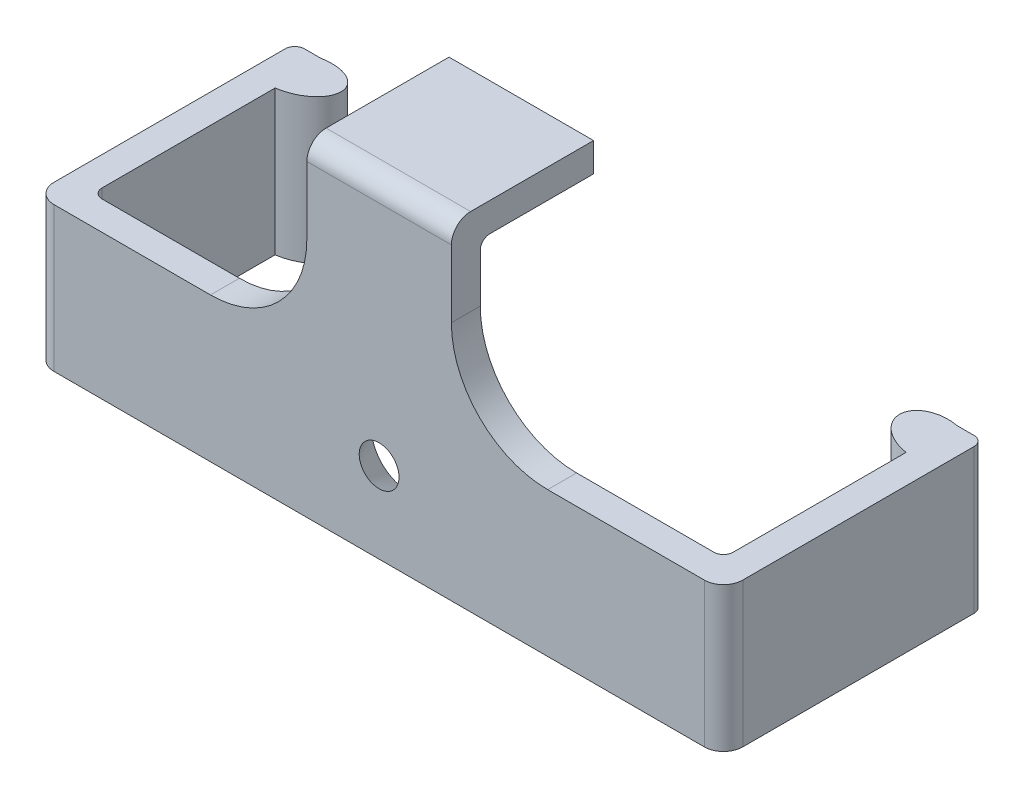
ISO-10303-21;
HEADER;
FILE_DESCRIPTION(('STEP AP214'),'2;1');
FILE_NAME('part.step','',(''),(''),'','','');
FILE_SCHEMA(('AUTOMOTIVE_DESIGN { 1 0 10303 214 1 1 1 1 }'));
ENDSEC;
DATA;
#1=APPLICATION_CONTEXT('core data for automotive mechanical design processes');
#2=APPLICATION_PROTOCOL_DEFINITION('international standard','automotive_design',2000,#1);
#3=PRODUCT_CONTEXT('',#1,'mechanical');
#4=PRODUCT('Part','Part','',(#3));
#5=PRODUCT_RELATED_PRODUCT_CATEGORY('part','',(#4));
#6=PRODUCT_DEFINITION_FORMATION('','',#4);
#7=PRODUCT_DEFINITION_CONTEXT('part definition',#1,'design');
#8=PRODUCT_DEFINITION('design','',#6,#7);
#9=PRODUCT_DEFINITION_SHAPE('','',#8);
#10=(LENGTH_UNIT() NAMED_UNIT(*) SI_UNIT(.MILLI.,.METRE.));
#11=(NAMED_UNIT(*) PLANE_ANGLE_UNIT() SI_UNIT($,.RADIAN.));
#12=(NAMED_UNIT(*) SI_UNIT($,.STERADIAN.) SOLID_ANGLE_UNIT());
#13=UNCERTAINTY_MEASURE_WITH_UNIT(LENGTH_MEASURE(1.E-05),#10,'distance_accuracy_value','');
#14=(GEOMETRIC_REPRESENTATION_CONTEXT(3) GLOBAL_UNCERTAINTY_ASSIGNED_CONTEXT((#13)) GLOBAL_UNIT_ASSIGNED_CONTEXT((#10,
#11,#12)) REPRESENTATION_CONTEXT('',''));
#15=CARTESIAN_POINT('',(0.,0.,0.));
#16=DIRECTION('',(0.,0.,1.));
#17=DIRECTION('',(1.,0.,0.));
#18=AXIS2_PLACEMENT_3D('',#15,#16,#17);
#19=CARTESIAN_POINT('',(-32.75,15.,-14.5));
#20=DIRECTION('',(0.,1.,0.));
#21=DIRECTION('',(0.,0.,1.));
#22=AXIS2_PLACEMENT_3D('',#19,#20,#21);
#23=PLANE('',#22);
#24=DIRECTION('',(-1.,0.,0.));
#25=VECTOR('',#24,1.);
#26=CARTESIAN_POINT('',(31.7499999999999,15.,7.00000000000001));
#27=LINE('',#26,#25);
#28=CARTESIAN_POINT('',(31.7499999999999,15.,7.00000000000001));
#29=VERTEX_POINT('',#28);
#30=CARTESIAN_POINT('',(17.5,15.,7.00000000000001));
#31=VERTEX_POINT('',#30);
#32=EDGE_CURVE('E344',#29,#31,#27,.T.);
#33=ORIENTED_EDGE('',*,*,#32,.T.);
#34=DIRECTION('',(0.,0.,1.));
#35=VECTOR('',#34,1.);
#36=CARTESIAN_POINT('',(17.5,15.,-14.4999999999998));
#37=LINE('',#36,#35);
#38=CARTESIAN_POINT('',(17.5,15.,10.));
#39=VERTEX_POINT('',#38);
#40=EDGE_CURVE('E349',#31,#39,#37,.T.);
#41=ORIENTED_EDGE('',*,*,#40,.T.);
#42=DIRECTION('',(1.,0.,0.));
#43=VECTOR('',#42,1.);
#44=CARTESIAN_POINT('',(-33.75,15.,10.));
#45=LINE('',#44,#43);
#46=CARTESIAN_POINT('',(33.75,15.,9.99999999999998));
#47=VERTEX_POINT('',#46);
#48=EDGE_CURVE('E326',#39,#47,#45,.T.);
#49=ORIENTED_EDGE('',*,*,#48,.T.);
#50=CARTESIAN_POINT('',(33.75,15.,8.));
#51=DIRECTION('',(0.,1.,0.));
#52=DIRECTION('',(0.,0.,1.));
#53=AXIS2_PLACEMENT_3D('',#50,#51,#52);
#54=CIRCLE('',#53,1.99999999999999);
#55=CARTESIAN_POINT('',(35.75,15.,8.));
#56=VERTEX_POINT('',#55);
#57=EDGE_CURVE('E325',#47,#56,#54,.T.);
#58=ORIENTED_EDGE('',*,*,#57,.T.);
#59=DIRECTION('',(0.,0.,-1.));
#60=VECTOR('',#59,1.);
#61=CARTESIAN_POINT('',(35.75,15.,-12.0000000000003));
#62=LINE('',#61,#60);
#63=CARTESIAN_POINT('',(35.75,15.,-16.));
#64=VERTEX_POINT('',#63);
#65=EDGE_CURVE('E505',#56,#64,#62,.T.);
#66=ORIENTED_EDGE('',*,*,#65,.T.);
#67=CARTESIAN_POINT('',(34.75,15.,-16.));
#68=DIRECTION('',(0.,1.,0.));
#69=DIRECTION('',(0.,0.,1.));
#70=AXIS2_PLACEMENT_3D('',#67,#68,#69);
#71=CIRCLE('',#70,0.999999999999997);
#72=CARTESIAN_POINT('',(34.75,15.,-17.));
#73=VERTEX_POINT('',#72);
#74=EDGE_CURVE('E506',#64,#73,#71,.T.);
#75=ORIENTED_EDGE('',*,*,#74,.T.);
#76=DIRECTION('',(-1.,0.,0.));
#77=VECTOR('',#76,1.);
#78=CARTESIAN_POINT('',(33.75,15.,-17.));
#79=LINE('',#78,#77);
#80=CARTESIAN_POINT('',(33.0197565475241,15.,-17.));
#81=VERTEX_POINT('',#80);
#82=EDGE_CURVE('E449',#73,#81,#79,.T.);
#83=ORIENTED_EDGE('',*,*,#82,.T.);
#84=CARTESIAN_POINT('',(32.75,15.,-14.5));
#85=DIRECTION('',(0.,1.,0.));
#86=DIRECTION('',(-0.969023980494892,0.,-0.246966648002996));
#87=AXIS2_PLACEMENT_3D('',#84,#85,#86);
#88=ELLIPSE('',#87,3.83087366526552,2.5);
#89=CARTESIAN_POINT('',(32.7499999999999,15.,-11.9550443249241));
#90=VERTEX_POINT('',#89);
#91=EDGE_CURVE('E446',#81,#90,#88,.T.);
#92=ORIENTED_EDGE('',*,*,#91,.T.);
#93=DIRECTION('',(0.,0.,1.));
#94=VECTOR('',#93,1.);
#95=CARTESIAN_POINT('',(32.7499999999999,15.,6.));
#96=LINE('',#95,#94);
#97=CARTESIAN_POINT('',(32.7499999999999,15.,6.));
#98=VERTEX_POINT('',#97);
#99=EDGE_CURVE('E444',#90,#98,#96,.T.);
#100=ORIENTED_EDGE('',*,*,#99,.T.);
#101=CARTESIAN_POINT('',(31.7499999999999,15.,6.));
#102=DIRECTION('',(0.,-1.,0.));
#103=DIRECTION('',(0.,0.,1.));
#104=AXIS2_PLACEMENT_3D('',#101,#102,#103);
#105=CIRCLE('',#104,1.);
#106=EDGE_CURVE('E352',#98,#29,#105,.T.);
#107=ORIENTED_EDGE('',*,*,#106,.T.);
#108=EDGE_LOOP('',(#33,#41,#49,#58,#66,#75,#83,#92,#100,#107));
#109=FACE_BOUND('',#108,.T.);
#110=ADVANCED_FACE('F33',(#109),#23,.T.);
#111=CARTESIAN_POINT('',(-32.75,15.,-14.5));
#112=DIRECTION('',(0.,1.,0.));
#113=DIRECTION('',(0.969023980494892,0.,-0.246966648002996));
#114=AXIS2_PLACEMENT_3D('',#111,#112,#113);
#115=ELLIPSE('',#114,3.83087366526552,2.50000000000001);
#116=DIRECTION('',(0.,-1.,0.));
#117=VECTOR('',#116,1.);
#118=SURFACE_OF_LINEAR_EXTRUSION('',#115,#117);
#119=CARTESIAN_POINT('',(-32.75,0.,-14.5));
#120=DIRECTION('',(0.,1.,0.));
#121=DIRECTION('',(0.969023980494892,0.,-0.246966648002996));
#122=AXIS2_PLACEMENT_3D('',#119,#120,#121);
#123=ELLIPSE('',#122,3.83087366526552,2.50000000000001);
#124=CARTESIAN_POINT('',(-32.75,0.,-11.9550443249241));
#125=VERTEX_POINT('',#124);
#126=CARTESIAN_POINT('',(-33.0197565475241,0.,-17.));
#127=VERTEX_POINT('',#126);
#128=EDGE_CURVE('E265',#125,#127,#123,.T.);
#129=ORIENTED_EDGE('',*,*,#128,.T.);
#130=DIRECTION('',(0.,-1.,0.));
#131=VECTOR('',#130,1.);
#132=CARTESIAN_POINT('',(-33.0197565475241,15.,-17.));
#133=LINE('',#132,#131);
#134=CARTESIAN_POINT('',(-33.0197565475241,15.,-17.));
#135=VERTEX_POINT('',#134);
#136=EDGE_CURVE('E357',#135,#127,#133,.T.);
#137=ORIENTED_EDGE('',*,*,#136,.F.);
#138=CARTESIAN_POINT('',(-32.75,15.,-11.9550443249241));
#139=VERTEX_POINT('',#138);
#140=EDGE_CURVE('E274',#139,#135,#115,.T.);
#141=ORIENTED_EDGE('',*,*,#140,.F.);
#142=DIRECTION('',(0.,-1.,0.));
#143=VECTOR('',#142,1.);
#144=CARTESIAN_POINT('',(-32.75,15.,-11.9550443249241));
#145=LINE('',#144,#143);
#146=EDGE_CURVE('E402',#139,#125,#145,.T.);
#147=ORIENTED_EDGE('',*,*,#146,.T.);
#148=EDGE_LOOP('',(#129,#137,#141,#147));
#149=FACE_BOUND('',#148,.T.);
#150=ADVANCED_FACE('F282',(#149),#118,.F.);
#151=CARTESIAN_POINT('',(-34.75,15.,-17.));
#152=DIRECTION('',(0.,0.,1.));
#153=DIRECTION('',(1.,0.,0.));
#154=AXIS2_PLACEMENT_3D('',#151,#152,#153);
#155=PLANE('',#154);
#156=DIRECTION('',(-1.,0.,0.));
#157=VECTOR('',#156,1.);
#158=CARTESIAN_POINT('',(-34.75,0.,-17.));
#159=LINE('',#158,#157);
#160=CARTESIAN_POINT('',(-34.75,0.,-17.));
#161=VERTEX_POINT('',#160);
#162=EDGE_CURVE('E437',#127,#161,#159,.T.);
#163=ORIENTED_EDGE('',*,*,#162,.T.);
#164=DIRECTION('',(0.,-1.,0.));
#165=VECTOR('',#164,1.);
#166=CARTESIAN_POINT('',(-34.75,15.,-17.));
#167=LINE('',#166,#165);
#168=CARTESIAN_POINT('',(-34.75,15.,-17.));
#169=VERTEX_POINT('',#168);
#170=EDGE_CURVE('E360',#169,#161,#167,.T.);
#171=ORIENTED_EDGE('',*,*,#170,.F.);
#172=DIRECTION('',(-1.,0.,0.));
#173=VECTOR('',#172,1.);
#174=CARTESIAN_POINT('',(-33.0197565475241,15.,-17.));
#175=LINE('',#174,#173);
#176=EDGE_CURVE('E278',#135,#169,#175,.T.);
#177=ORIENTED_EDGE('',*,*,#176,.F.);
#178=ORIENTED_EDGE('',*,*,#136,.T.);
#179=EDGE_LOOP('',(#163,#171,#177,#178));
#180=FACE_BOUND('',#179,.T.);
#181=ADVANCED_FACE('F285',(#180),#155,.F.);
#182=CARTESIAN_POINT('',(-34.75,15.,-16.));
#183=DIRECTION('',(0.,-1.,0.));
#184=DIRECTION('',(0.,0.,-1.));
#185=AXIS2_PLACEMENT_3D('',#182,#183,#184);
#186=CYLINDRICAL_SURFACE('',#185,1.);
#187=CARTESIAN_POINT('',(-34.75,0.,-16.));
#188=DIRECTION('',(0.,1.,0.));
#189=DIRECTION('',(0.,0.,-1.));
#190=AXIS2_PLACEMENT_3D('',#187,#188,#189);
#191=CIRCLE('',#190,1.);
#192=CARTESIAN_POINT('',(-35.75,0.,-16.));
#193=VERTEX_POINT('',#192);
#194=EDGE_CURVE('E434',#161,#193,#191,.T.);
#195=ORIENTED_EDGE('',*,*,#194,.T.);
#196=DIRECTION('',(0.,-1.,0.));
#197=VECTOR('',#196,1.);
#198=CARTESIAN_POINT('',(-35.75,15.,-16.));
#199=LINE('',#198,#197);
#200=CARTESIAN_POINT('',(-35.75,15.,-16.));
#201=VERTEX_POINT('',#200);
#202=EDGE_CURVE('E365',#201,#193,#199,.T.);
#203=ORIENTED_EDGE('',*,*,#202,.F.);
#204=CARTESIAN_POINT('',(-34.75,15.,-16.));
#205=DIRECTION('',(0.,1.,0.));
#206=DIRECTION('',(0.,0.,-1.));
#207=AXIS2_PLACEMENT_3D('',#204,#205,#206);
#208=CIRCLE('',#207,1.);
#209=EDGE_CURVE('E500',#169,#201,#208,.T.);
#210=ORIENTED_EDGE('',*,*,#209,.F.);
#211=ORIENTED_EDGE('',*,*,#170,.T.);
#212=EDGE_LOOP('',(#195,#203,#210,#211));
#213=FACE_BOUND('',#212,.T.);
#214=ADVANCED_FACE('F485',(#213),#186,.T.);
#215=CARTESIAN_POINT('',(-35.75,15.,-12.0000000000001));
#216=DIRECTION('',(1.,0.,0.));
#217=DIRECTION('',(0.,0.,-1.));
#218=AXIS2_PLACEMENT_3D('',#215,#216,#217);
#219=PLANE('',#218);
#220=DIRECTION('',(0.,0.,1.));
#221=VECTOR('',#220,1.);
#222=CARTESIAN_POINT('',(-35.75,0.,-12.0000000000001));
#223=LINE('',#222,#221);
#224=CARTESIAN_POINT('',(-35.75,0.,7.99999999999998));
#225=VERTEX_POINT('',#224);
#226=EDGE_CURVE('E432',#193,#225,#223,.T.);
#227=ORIENTED_EDGE('',*,*,#226,.T.);
#228=DIRECTION('',(0.,-1.,0.));
#229=VECTOR('',#228,1.);
#230=CARTESIAN_POINT('',(-35.75,15.,7.99999999999998));
#231=LINE('',#230,#229);
#232=CARTESIAN_POINT('',(-35.75,15.,7.99999999999998));
#233=VERTEX_POINT('',#232);
#234=EDGE_CURVE('E368',#233,#225,#231,.T.);
#235=ORIENTED_EDGE('',*,*,#234,.F.);
#236=DIRECTION('',(0.,0.,1.));
#237=VECTOR('',#236,1.);
#238=CARTESIAN_POINT('',(-35.75,15.,-16.));
#239=LINE('',#238,#237);
#240=EDGE_CURVE('E499',#201,#233,#239,.T.);
#241=ORIENTED_EDGE('',*,*,#240,.F.);
#242=ORIENTED_EDGE('',*,*,#202,.T.);
#243=EDGE_LOOP('',(#227,#235,#241,#242));
#244=FACE_BOUND('',#243,.T.);
#245=ADVANCED_FACE('F482',(#244),#219,.F.);
#246=CARTESIAN_POINT('',(-33.75,15.,8.));
#247=DIRECTION('',(0.,-1.,0.));
#248=DIRECTION('',(0.,0.,-1.));
#249=AXIS2_PLACEMENT_3D('',#246,#247,#248);
#250=CYLINDRICAL_SURFACE('',#249,1.99999999999999);
#251=CARTESIAN_POINT('',(-33.75,0.,8.));
#252=DIRECTION('',(0.,1.,0.));
#253=DIRECTION('',(0.,0.,1.));
#254=AXIS2_PLACEMENT_3D('',#251,#252,#253);
#255=CIRCLE('',#254,1.99999999999999);
#256=CARTESIAN_POINT('',(-33.75,0.,10.));
#257=VERTEX_POINT('',#256);
#258=EDGE_CURVE('E429',#225,#257,#255,.T.);
#259=ORIENTED_EDGE('',*,*,#258,.T.);
#260=DIRECTION('',(0.,-1.,0.));
#261=VECTOR('',#260,1.);
#262=CARTESIAN_POINT('',(-33.75,15.,10.));
#263=LINE('',#262,#261);
#264=CARTESIAN_POINT('',(-33.75,15.,10.));
#265=VERTEX_POINT('',#264);
#266=EDGE_CURVE('E371',#265,#257,#263,.T.);
#267=ORIENTED_EDGE('',*,*,#266,.F.);
#268=CARTESIAN_POINT('',(-33.75,15.,8.));
#269=DIRECTION('',(0.,1.,0.));
#270=DIRECTION('',(0.,0.,1.));
#271=AXIS2_PLACEMENT_3D('',#268,#269,#270);
#272=CIRCLE('',#271,1.99999999999999);
#273=EDGE_CURVE('E322',#233,#265,#272,.T.);
#274=ORIENTED_EDGE('',*,*,#273,.F.);
#275=ORIENTED_EDGE('',*,*,#234,.T.);
#276=EDGE_LOOP('',(#259,#267,#274,#275));
#277=FACE_BOUND('',#276,.T.);
#278=ADVANCED_FACE('F478',(#277),#250,.T.);
#279=CARTESIAN_POINT('',(32.5,15.,10.));
#280=DIRECTION('',(0.,0.,-1.));
#281=DIRECTION('',(-1.,0.,0.));
#282=AXIS2_PLACEMENT_3D('',#279,#280,#281);
#283=PLANE('',#282);
#284=CARTESIAN_POINT('',(0.,8.39705008087006,10.0000000000009));
#285=DIRECTION('',(0.,0.,-1.));
#286=DIRECTION('',(-1.,0.,0.));
#287=AXIS2_PLACEMENT_3D('',#284,#285,#286);
#288=CIRCLE('',#287,2.06794919243061);
#289=CARTESIAN_POINT('',(-2.06794919243062,8.39705008087006,10.0000000000009));
#290=VERTEX_POINT('',#289);
#291=EDGE_CURVE('E232',#290,#290,#288,.T.);
#292=ORIENTED_EDGE('',*,*,#291,.T.);
#293=EDGE_LOOP('',(#292));
#294=FACE_BOUND('',#293,.T.);
#295=DIRECTION('',(1.,0.,0.));
#296=VECTOR('',#295,1.);
#297=CARTESIAN_POINT('',(32.5,0.,10.));
#298=LINE('',#297,#296);
#299=CARTESIAN_POINT('',(33.75,0.,9.99999999999998));
#300=VERTEX_POINT('',#299);
#301=EDGE_CURVE('E427',#257,#300,#298,.T.);
#302=ORIENTED_EDGE('',*,*,#301,.T.);
#303=DIRECTION('',(0.,-1.,0.));
#304=VECTOR('',#303,1.);
#305=CARTESIAN_POINT('',(33.75,15.,9.99999999999998));
#306=LINE('',#305,#304);
#307=EDGE_CURVE('E373',#47,#300,#306,.T.);
#308=ORIENTED_EDGE('',*,*,#307,.F.);
#309=ORIENTED_EDGE('',*,*,#48,.F.);
#310=CARTESIAN_POINT('',(17.5,25.,10.));
#311=DIRECTION('',(0.,0.,-1.));
#312=DIRECTION('',(-1.,0.,0.));
#313=AXIS2_PLACEMENT_3D('',#310,#311,#312);
#314=CIRCLE('',#313,10.);
#315=CARTESIAN_POINT('',(7.49999999999997,25.,10.0000000000008));
#316=VERTEX_POINT('',#315);
#317=EDGE_CURVE('E331',#39,#316,#314,.T.);
#318=ORIENTED_EDGE('',*,*,#317,.T.);
#319=DIRECTION('',(0.,1.,0.));
#320=VECTOR('',#319,1.);
#321=CARTESIAN_POINT('',(7.49999999999997,0.,10.0000000000008));
#322=LINE('',#321,#320);
#323=CARTESIAN_POINT('',(7.49999999999997,31.9999999999998,10.0000000000008));
#324=VERTEX_POINT('',#323);
#325=EDGE_CURVE('E256',#316,#324,#322,.T.);
#326=ORIENTED_EDGE('',*,*,#325,.T.);
#327=DIRECTION('',(-1.,0.,0.));
#328=VECTOR('',#327,1.);
#329=CARTESIAN_POINT('',(7.49999999999997,31.9999999999998,10.0000000000008));
#330=LINE('',#329,#328);
#331=CARTESIAN_POINT('',(-7.50000000000003,31.9999999999998,10.0000000000008));
#332=VERTEX_POINT('',#331);
#333=EDGE_CURVE('E268',#324,#332,#330,.T.);
#334=ORIENTED_EDGE('',*,*,#333,.T.);
#335=DIRECTION('',(0.,1.,0.));
#336=VECTOR('',#335,1.);
#337=CARTESIAN_POINT('',(-7.50000000000003,0.,10.0000000000008));
#338=LINE('',#337,#336);
#339=CARTESIAN_POINT('',(-7.50000000000003,25.,10.0000000000008));
#340=VERTEX_POINT('',#339);
#341=EDGE_CURVE('E242',#340,#332,#338,.T.);
#342=ORIENTED_EDGE('',*,*,#341,.F.);
#343=CARTESIAN_POINT('',(-17.5,25.,10.));
#344=DIRECTION('',(0.,0.,-1.));
#345=DIRECTION('',(-1.,0.,0.));
#346=AXIS2_PLACEMENT_3D('',#343,#344,#345);
#347=CIRCLE('',#346,10.);
#348=CARTESIAN_POINT('',(-17.5,15.,10.));
#349=VERTEX_POINT('',#348);
#350=EDGE_CURVE('E41',#340,#349,#347,.T.);
#351=ORIENTED_EDGE('',*,*,#350,.T.);
#352=EDGE_CURVE('E320',#265,#349,#45,.T.);
#353=ORIENTED_EDGE('',*,*,#352,.F.);
#354=ORIENTED_EDGE('',*,*,#266,.T.);
#355=EDGE_LOOP('',(#302,#308,#309,#318,#326,#334,#342,#351,#353,#354));
#356=FACE_BOUND('',#355,.T.);
#357=ADVANCED_FACE('F474',(#294,#356),#283,.F.);
#358=CARTESIAN_POINT('',(33.75,15.,8.));
#359=DIRECTION('',(0.,-1.,0.));
#360=DIRECTION('',(0.,0.,-1.));
#361=AXIS2_PLACEMENT_3D('',#358,#359,#360);
#362=CYLINDRICAL_SURFACE('',#361,1.99999999999999);
#363=CARTESIAN_POINT('',(33.75,0.,8.));
#364=DIRECTION('',(0.,1.,0.));
#365=DIRECTION('',(0.,0.,1.));
#366=AXIS2_PLACEMENT_3D('',#363,#364,#365);
#367=CIRCLE('',#366,1.99999999999999);
#368=CARTESIAN_POINT('',(35.75,0.,8.));
#369=VERTEX_POINT('',#368);
#370=EDGE_CURVE('E424',#300,#369,#367,.T.);
#371=ORIENTED_EDGE('',*,*,#370,.T.);
#372=DIRECTION('',(0.,-1.,0.));
#373=VECTOR('',#372,1.);
#374=CARTESIAN_POINT('',(35.75,15.,8.));
#375=LINE('',#374,#373);
#376=EDGE_CURVE('E376',#56,#369,#375,.T.);
#377=ORIENTED_EDGE('',*,*,#376,.F.);
#378=ORIENTED_EDGE('',*,*,#57,.F.);
#379=ORIENTED_EDGE('',*,*,#307,.T.);
#380=EDGE_LOOP('',(#371,#377,#378,#379));
#381=FACE_BOUND('',#380,.T.);
#382=ADVANCED_FACE('F470',(#381),#362,.T.);
#383=CARTESIAN_POINT('',(35.75,15.,-16.));
#384=DIRECTION('',(-1.,0.,0.));
#385=DIRECTION('',(0.,0.,1.));
#386=AXIS2_PLACEMENT_3D('',#383,#384,#385);
#387=PLANE('',#386);
#388=DIRECTION('',(0.,0.,-1.));
#389=VECTOR('',#388,1.);
#390=CARTESIAN_POINT('',(35.75,0.,-16.));
#391=LINE('',#390,#389);
#392=CARTESIAN_POINT('',(35.75,0.,-16.));
#393=VERTEX_POINT('',#392);
#394=EDGE_CURVE('E422',#369,#393,#391,.T.);
#395=ORIENTED_EDGE('',*,*,#394,.T.);
#396=DIRECTION('',(0.,-1.,0.));
#397=VECTOR('',#396,1.);
#398=CARTESIAN_POINT('',(35.75,15.,-16.));
#399=LINE('',#398,#397);
#400=EDGE_CURVE('E379',#64,#393,#399,.T.);
#401=ORIENTED_EDGE('',*,*,#400,.F.);
#402=ORIENTED_EDGE('',*,*,#65,.F.);
#403=ORIENTED_EDGE('',*,*,#376,.T.);
#404=EDGE_LOOP('',(#395,#401,#402,#403));
#405=FACE_BOUND('',#404,.T.);
#406=ADVANCED_FACE('F466',(#405),#387,.F.);
#407=CARTESIAN_POINT('',(34.75,15.,-16.));
#408=DIRECTION('',(0.,-1.,0.));
#409=DIRECTION('',(0.,0.,-1.));
#410=AXIS2_PLACEMENT_3D('',#407,#408,#409);
#411=CYLINDRICAL_SURFACE('',#410,0.999999999999997);
#412=CARTESIAN_POINT('',(34.75,0.,-16.));
#413=DIRECTION('',(0.,1.,0.));
#414=DIRECTION('',(0.,0.,1.));
#415=AXIS2_PLACEMENT_3D('',#412,#413,#414);
#416=CIRCLE('',#415,0.999999999999997);
#417=CARTESIAN_POINT('',(34.75,0.,-17.));
#418=VERTEX_POINT('',#417);
#419=EDGE_CURVE('E419',#393,#418,#416,.T.);
#420=ORIENTED_EDGE('',*,*,#419,.T.);
#421=DIRECTION('',(0.,-1.,0.));
#422=VECTOR('',#421,1.);
#423=CARTESIAN_POINT('',(34.75,15.,-17.));
#424=LINE('',#423,#422);
#425=EDGE_CURVE('E382',#73,#418,#424,.T.);
#426=ORIENTED_EDGE('',*,*,#425,.F.);
#427=ORIENTED_EDGE('',*,*,#74,.F.);
#428=ORIENTED_EDGE('',*,*,#400,.T.);
#429=EDGE_LOOP('',(#420,#426,#427,#428));
#430=FACE_BOUND('',#429,.T.);
#431=ADVANCED_FACE('F462',(#430),#411,.T.);
#432=CARTESIAN_POINT('',(33.0197565475241,15.,-17.));
#433=DIRECTION('',(0.,0.,1.));
#434=DIRECTION('',(1.,0.,0.));
#435=AXIS2_PLACEMENT_3D('',#432,#433,#434);
#436=PLANE('',#435);
#437=DIRECTION('',(-1.,0.,0.));
#438=VECTOR('',#437,1.);
#439=CARTESIAN_POINT('',(33.0197565475241,0.,-17.));
#440=LINE('',#439,#438);
#441=CARTESIAN_POINT('',(33.0197565475241,0.,-17.));
#442=VERTEX_POINT('',#441);
#443=EDGE_CURVE('E417',#418,#442,#440,.T.);
#444=ORIENTED_EDGE('',*,*,#443,.T.);
#445=DIRECTION('',(0.,-1.,0.));
#446=VECTOR('',#445,1.);
#447=CARTESIAN_POINT('',(33.0197565475241,15.,-17.));
#448=LINE('',#447,#446);
#449=EDGE_CURVE('E385',#81,#442,#448,.T.);
#450=ORIENTED_EDGE('',*,*,#449,.F.);
#451=ORIENTED_EDGE('',*,*,#82,.F.);
#452=ORIENTED_EDGE('',*,*,#425,.T.);
#453=EDGE_LOOP('',(#444,#450,#451,#452));
#454=FACE_BOUND('',#453,.T.);
#455=ADVANCED_FACE('F457',(#454),#436,.F.);
#456=DIRECTION('',(0.,-1.,0.));
#457=VECTOR('',#456,1.);
#458=SURFACE_OF_LINEAR_EXTRUSION('',#88,#457);
#459=CARTESIAN_POINT('',(32.75,0.,-14.5));
#460=DIRECTION('',(0.,1.,0.));
#461=DIRECTION('',(-0.969023980494892,0.,-0.246966648002996));
#462=AXIS2_PLACEMENT_3D('',#459,#460,#461);
#463=ELLIPSE('',#462,3.83087366526552,2.5);
#464=CARTESIAN_POINT('',(32.7499999999999,0.,-11.9550443249241));
#465=VERTEX_POINT('',#464);
#466=EDGE_CURVE('E415',#442,#465,#463,.T.);
#467=ORIENTED_EDGE('',*,*,#466,.T.);
#468=DIRECTION('',(0.,-1.,0.));
#469=VECTOR('',#468,1.);
#470=CARTESIAN_POINT('',(32.7499999999999,15.,-11.9550443249241));
#471=LINE('',#470,#469);
#472=EDGE_CURVE('E388',#90,#465,#471,.T.);
#473=ORIENTED_EDGE('',*,*,#472,.F.);
#474=ORIENTED_EDGE('',*,*,#91,.F.);
#475=ORIENTED_EDGE('',*,*,#449,.T.);
#476=EDGE_LOOP('',(#467,#473,#474,#475));
#477=FACE_BOUND('',#476,.T.);
#478=ADVANCED_FACE('F452',(#477),#458,.F.);
#479=CARTESIAN_POINT('',(32.7499999999999,15.,6.));
#480=DIRECTION('',(1.,0.,0.));
#481=DIRECTION('',(0.,0.,-1.));
#482=AXIS2_PLACEMENT_3D('',#479,#480,#481);
#483=PLANE('',#482);
#484=DIRECTION('',(0.,0.,1.));
#485=VECTOR('',#484,1.);
#486=CARTESIAN_POINT('',(32.7499999999999,0.,6.));
#487=LINE('',#486,#485);
#488=CARTESIAN_POINT('',(32.7499999999999,0.,6.));
#489=VERTEX_POINT('',#488);
#490=EDGE_CURVE('E413',#465,#489,#487,.T.);
#491=ORIENTED_EDGE('',*,*,#490,.T.);
#492=DIRECTION('',(0.,-1.,0.));
#493=VECTOR('',#492,1.);
#494=CARTESIAN_POINT('',(32.7499999999999,15.,6.));
#495=LINE('',#494,#493);
#496=EDGE_CURVE('E391',#98,#489,#495,.T.);
#497=ORIENTED_EDGE('',*,*,#496,.F.);
#498=ORIENTED_EDGE('',*,*,#99,.F.);
#499=ORIENTED_EDGE('',*,*,#472,.T.);
#500=EDGE_LOOP('',(#491,#497,#498,#499));
#501=FACE_BOUND('',#500,.T.);
#502=ADVANCED_FACE('F456',(#501),#483,.F.);
#503=CARTESIAN_POINT('',(31.7499999999999,15.,6.));
#504=DIRECTION('',(0.,-1.,0.));
#505=DIRECTION('',(0.,0.,-1.));
#506=AXIS2_PLACEMENT_3D('',#503,#504,#505);
#507=CYLINDRICAL_SURFACE('',#506,1.);
#508=CARTESIAN_POINT('',(31.7499999999999,0.,6.));
#509=DIRECTION('',(0.,-1.,0.));
#510=DIRECTION('',(0.,0.,1.));
#511=AXIS2_PLACEMENT_3D('',#508,#509,#510);
#512=CIRCLE('',#511,1.);
#513=CARTESIAN_POINT('',(31.7499999999999,0.,7.00000000000001));
#514=VERTEX_POINT('',#513);
#515=EDGE_CURVE('E411',#489,#514,#512,.T.);
#516=ORIENTED_EDGE('',*,*,#515,.T.);
#517=DIRECTION('',(0.,-1.,0.));
#518=VECTOR('',#517,1.);
#519=CARTESIAN_POINT('',(31.7499999999999,15.,7.00000000000001));
#520=LINE('',#519,#518);
#521=EDGE_CURVE('E394',#29,#514,#520,.T.);
#522=ORIENTED_EDGE('',*,*,#521,.F.);
#523=ORIENTED_EDGE('',*,*,#106,.F.);
#524=ORIENTED_EDGE('',*,*,#496,.T.);
#525=EDGE_LOOP('',(#516,#522,#523,#524));
#526=FACE_BOUND('',#525,.T.);
#527=ADVANCED_FACE('F520',(#526),#507,.F.);
#528=CARTESIAN_POINT('',(31.7499999999999,15.,7.00000000000001));
#529=DIRECTION('',(0.,0.,1.));
#530=DIRECTION('',(1.,0.,0.));
#531=AXIS2_PLACEMENT_3D('',#528,#529,#530);
#532=PLANE('',#531);
#533=CARTESIAN_POINT('',(0.,8.39705008087006,7.00000000000001));
#534=DIRECTION('',(0.,0.,-1.));
#535=DIRECTION('',(-1.,0.,0.));
#536=AXIS2_PLACEMENT_3D('',#533,#534,#535);
#537=CIRCLE('',#536,3.8);
#538=CARTESIAN_POINT('',(-3.8,8.39705008087006,7.));
#539=VERTEX_POINT('',#538);
#540=EDGE_CURVE('E235',#539,#539,#537,.T.);
#541=ORIENTED_EDGE('',*,*,#540,.F.);
#542=EDGE_LOOP('',(#541));
#543=FACE_BOUND('',#542,.T.);
#544=CARTESIAN_POINT('',(-17.5,15.,7.00000000000001));
#545=VERTEX_POINT('',#544);
#546=CARTESIAN_POINT('',(-31.75,15.,7.00000000000001));
#547=VERTEX_POINT('',#546);
#548=EDGE_CURVE('E355',#545,#547,#27,.T.);
#549=ORIENTED_EDGE('',*,*,#548,.F.);
#550=CARTESIAN_POINT('',(-17.5,25.,7.00000000000001));
#551=DIRECTION('',(0.,0.,1.));
#552=DIRECTION('',(1.,0.,0.));
#553=AXIS2_PLACEMENT_3D('',#550,#551,#552);
#554=CIRCLE('',#553,10.);
#555=CARTESIAN_POINT('',(-7.50000000000002,25.,6.99999999999991));
#556=VERTEX_POINT('',#555);
#557=EDGE_CURVE('E11',#545,#556,#554,.T.);
#558=ORIENTED_EDGE('',*,*,#557,.T.);
#559=DIRECTION('',(0.,-1.,0.));
#560=VECTOR('',#559,1.);
#561=CARTESIAN_POINT('',(-7.50000000000002,29.9999999999999,6.99999999999987));
#562=LINE('',#561,#560);
#563=CARTESIAN_POINT('',(-7.50000000000002,29.9999999999999,6.99999999999987));
#564=VERTEX_POINT('',#563);
#565=EDGE_CURVE('E240',#564,#556,#562,.T.);
#566=ORIENTED_EDGE('',*,*,#565,.F.);
#567=DIRECTION('',(-1.,0.,0.));
#568=VECTOR('',#567,1.);
#569=CARTESIAN_POINT('',(7.49999999999998,29.9999999999999,6.99999999999992));
#570=LINE('',#569,#568);
#571=CARTESIAN_POINT('',(7.49999999999998,29.9999999999999,6.99999999999992));
#572=VERTEX_POINT('',#571);
#573=EDGE_CURVE('E271',#572,#564,#570,.T.);
#574=ORIENTED_EDGE('',*,*,#573,.F.);
#575=DIRECTION('',(0.,-1.,0.));
#576=VECTOR('',#575,1.);
#577=CARTESIAN_POINT('',(7.49999999999998,29.9999999999999,6.99999999999992));
#578=LINE('',#577,#576);
#579=CARTESIAN_POINT('',(7.49999999999998,25.,6.99999999999996));
#580=VERTEX_POINT('',#579);
#581=EDGE_CURVE('E253',#572,#580,#578,.T.);
#582=ORIENTED_EDGE('',*,*,#581,.T.);
#583=CARTESIAN_POINT('',(17.5,25.,7.));
#584=DIRECTION('',(0.,0.,1.));
#585=DIRECTION('',(1.,0.,0.));
#586=AXIS2_PLACEMENT_3D('',#583,#584,#585);
#587=CIRCLE('',#586,10.);
#588=EDGE_CURVE('E334',#580,#31,#587,.T.);
#589=ORIENTED_EDGE('',*,*,#588,.T.);
#590=ORIENTED_EDGE('',*,*,#32,.F.);
#591=ORIENTED_EDGE('',*,*,#521,.T.);
#592=DIRECTION('',(-1.,0.,0.));
#593=VECTOR('',#592,1.);
#594=CARTESIAN_POINT('',(31.7499999999999,0.,7.00000000000001));
#595=LINE('',#594,#593);
#596=CARTESIAN_POINT('',(-31.75,0.,7.00000000000001));
#597=VERTEX_POINT('',#596);
#598=EDGE_CURVE('E409',#514,#597,#595,.T.);
#599=ORIENTED_EDGE('',*,*,#598,.T.);
#600=DIRECTION('',(0.,-1.,0.));
#601=VECTOR('',#600,1.);
#602=CARTESIAN_POINT('',(-31.75,15.,7.00000000000001));
#603=LINE('',#602,#601);
#604=EDGE_CURVE('E396',#547,#597,#603,.T.);
#605=ORIENTED_EDGE('',*,*,#604,.F.);
#606=EDGE_LOOP('',(#549,#558,#566,#574,#582,#589,#590,#591,#599,#605));
#607=FACE_BOUND('',#606,.T.);
#608=ADVANCED_FACE('F342',(#543,#607),#532,.F.);
#609=CARTESIAN_POINT('',(-31.75,15.,6.00000000000001));
#610=DIRECTION('',(0.,-1.,0.));
#611=DIRECTION('',(0.,0.,-1.));
#612=AXIS2_PLACEMENT_3D('',#609,#610,#611);
#613=CYLINDRICAL_SURFACE('',#612,0.999999999999999);
#614=CARTESIAN_POINT('',(-31.75,0.,6.00000000000001));
#615=DIRECTION('',(0.,-1.,0.));
#616=DIRECTION('',(0.,0.,-1.));
#617=AXIS2_PLACEMENT_3D('',#614,#615,#616);
#618=CIRCLE('',#617,0.999999999999999);
#619=CARTESIAN_POINT('',(-32.75,0.,6.00000000000001));
#620=VERTEX_POINT('',#619);
#621=EDGE_CURVE('E407',#597,#620,#618,.T.);
#622=ORIENTED_EDGE('',*,*,#621,.T.);
#623=DIRECTION('',(0.,-1.,0.));
#624=VECTOR('',#623,1.);
#625=CARTESIAN_POINT('',(-32.75,15.,6.00000000000001));
#626=LINE('',#625,#624);
#627=CARTESIAN_POINT('',(-32.75,15.,6.00000000000001));
#628=VERTEX_POINT('',#627);
#629=EDGE_CURVE('E399',#628,#620,#626,.T.);
#630=ORIENTED_EDGE('',*,*,#629,.F.);
#631=CARTESIAN_POINT('',(-31.75,15.,6.00000000000001));
#632=DIRECTION('',(0.,-1.,0.));
#633=DIRECTION('',(0.,0.,-1.));
#634=AXIS2_PLACEMENT_3D('',#631,#632,#633);
#635=CIRCLE('',#634,0.999999999999999);
#636=EDGE_CURVE('E354',#547,#628,#635,.T.);
#637=ORIENTED_EDGE('',*,*,#636,.F.);
#638=ORIENTED_EDGE('',*,*,#604,.T.);
#639=EDGE_LOOP('',(#622,#630,#637,#638));
#640=FACE_BOUND('',#639,.T.);
#641=ADVANCED_FACE('F317',(#640),#613,.F.);
#642=CARTESIAN_POINT('',(-32.75,15.,6.00000000000001));
#643=DIRECTION('',(-1.,0.,0.));
#644=DIRECTION('',(0.,0.,1.));
#645=AXIS2_PLACEMENT_3D('',#642,#643,#644);
#646=PLANE('',#645);
#647=DIRECTION('',(0.,0.,-1.));
#648=VECTOR('',#647,1.);
#649=CARTESIAN_POINT('',(-32.75,0.,6.00000000000001));
#650=LINE('',#649,#648);
#651=EDGE_CURVE('E279',#620,#125,#650,.T.);
#652=ORIENTED_EDGE('',*,*,#651,.T.);
#653=ORIENTED_EDGE('',*,*,#146,.F.);
#654=DIRECTION('',(0.,0.,-1.));
#655=VECTOR('',#654,1.);
#656=CARTESIAN_POINT('',(-32.75,15.,6.00000000000001));
#657=LINE('',#656,#655);
#658=EDGE_CURVE('E405',#628,#139,#657,.T.);
#659=ORIENTED_EDGE('',*,*,#658,.F.);
#660=ORIENTED_EDGE('',*,*,#629,.T.);
#661=EDGE_LOOP('',(#652,#653,#659,#660));
#662=FACE_BOUND('',#661,.T.);
#663=ADVANCED_FACE('F311',(#662),#646,.F.);
#664=ORIENTED_EDGE('',*,*,#352,.T.);
#665=DIRECTION('',(0.,0.,1.));
#666=VECTOR('',#665,1.);
#667=CARTESIAN_POINT('',(-17.5,15.,6.99999999999997));
#668=LINE('',#667,#666);
#669=EDGE_CURVE('E54',#349,#545,#668,.F.);
#670=ORIENTED_EDGE('',*,*,#669,.T.);
#671=ORIENTED_EDGE('',*,*,#548,.T.);
#672=ORIENTED_EDGE('',*,*,#636,.T.);
#673=ORIENTED_EDGE('',*,*,#658,.T.);
#674=ORIENTED_EDGE('',*,*,#140,.T.);
#675=ORIENTED_EDGE('',*,*,#176,.T.);
#676=ORIENTED_EDGE('',*,*,#209,.T.);
#677=ORIENTED_EDGE('',*,*,#240,.T.);
#678=ORIENTED_EDGE('',*,*,#273,.T.);
#679=EDGE_LOOP('',(#664,#670,#671,#672,#673,#674,#675,#676,#677,#678));
#680=FACE_BOUND('',#679,.T.);
#681=ADVANCED_FACE('F303',(#680),#23,.T.);
#682=CARTESIAN_POINT('',(-32.75,0.,-14.5));
#683=DIRECTION('',(0.,1.,0.));
#684=DIRECTION('',(0.,0.,1.));
#685=AXIS2_PLACEMENT_3D('',#682,#683,#684);
#686=PLANE('',#685);
#687=ORIENTED_EDGE('',*,*,#621,.F.);
#688=ORIENTED_EDGE('',*,*,#598,.F.);
#689=ORIENTED_EDGE('',*,*,#515,.F.);
#690=ORIENTED_EDGE('',*,*,#490,.F.);
#691=ORIENTED_EDGE('',*,*,#466,.F.);
#692=ORIENTED_EDGE('',*,*,#443,.F.);
#693=ORIENTED_EDGE('',*,*,#419,.F.);
#694=ORIENTED_EDGE('',*,*,#394,.F.);
#695=ORIENTED_EDGE('',*,*,#370,.F.);
#696=ORIENTED_EDGE('',*,*,#301,.F.);
#697=ORIENTED_EDGE('',*,*,#258,.F.);
#698=ORIENTED_EDGE('',*,*,#226,.F.);
#699=ORIENTED_EDGE('',*,*,#194,.F.);
#700=ORIENTED_EDGE('',*,*,#162,.F.);
#701=ORIENTED_EDGE('',*,*,#128,.F.);
#702=ORIENTED_EDGE('',*,*,#651,.F.);
#703=EDGE_LOOP('',(#687,#688,#689,#690,#691,#692,#693,#694,#695,#696,#697,#698,#699,#700,#701,#702));
#704=FACE_BOUND('',#703,.T.);
#705=ADVANCED_FACE('F310',(#704),#686,.F.);
#706=CARTESIAN_POINT('',(7.50000000000002,30.9999999999999,-4.7584982875239));
#707=DIRECTION('',(0.,0.,-1.));
#708=DIRECTION('',(-1.,0.,0.));
#709=AXIS2_PLACEMENT_3D('',#706,#707,#708);
#710=PLANE('',#709);
#711=DIRECTION('',(-1.,0.,0.));
#712=VECTOR('',#711,1.);
#713=CARTESIAN_POINT('',(7.50000000000002,30.9999999999999,-4.7584982875239));
#714=LINE('',#713,#712);
#715=CARTESIAN_POINT('',(7.50000000000002,30.9999999999999,-4.7584982875239));
#716=VERTEX_POINT('',#715);
#717=CARTESIAN_POINT('',(-7.49999999999998,30.9999999999999,-4.75849828752395));
#718=VERTEX_POINT('',#717);
#719=EDGE_CURVE('E205',#716,#718,#714,.T.);
#720=ORIENTED_EDGE('',*,*,#719,.T.);
#721=DIRECTION('',(0.,-1.,0.));
#722=VECTOR('',#721,1.);
#723=CARTESIAN_POINT('',(-7.49999999999998,30.9999999999999,-4.75849828752395));
#724=LINE('',#723,#722);
#725=CARTESIAN_POINT('',(-7.49999999999998,33.9999999999999,-4.75849828752395));
#726=VERTEX_POINT('',#725);
#727=EDGE_CURVE('E209',#726,#718,#724,.T.);
#728=ORIENTED_EDGE('',*,*,#727,.F.);
#729=DIRECTION('',(-1.,0.,0.));
#730=VECTOR('',#729,1.);
#731=CARTESIAN_POINT('',(7.50000000000002,33.9999999999999,-4.7584982875239));
#732=LINE('',#731,#730);
#733=CARTESIAN_POINT('',(7.50000000000002,33.9999999999999,-4.7584982875239));
#734=VERTEX_POINT('',#733);
#735=EDGE_CURVE('E263',#734,#726,#732,.T.);
#736=ORIENTED_EDGE('',*,*,#735,.F.);
#737=DIRECTION('',(0.,-1.,0.));
#738=VECTOR('',#737,1.);
#739=CARTESIAN_POINT('',(7.50000000000002,30.9999999999999,-4.7584982875239));
#740=LINE('',#739,#738);
#741=EDGE_CURVE('E211',#734,#716,#740,.T.);
#742=ORIENTED_EDGE('',*,*,#741,.T.);
#743=EDGE_LOOP('',(#720,#728,#736,#742));
#744=FACE_BOUND('',#743,.T.);
#745=ADVANCED_FACE('F207',(#744),#710,.T.);
#746=CARTESIAN_POINT('',(7.50000000000002,33.9999999999999,-4.7584982875239));
#747=DIRECTION('',(0.,1.,0.));
#748=DIRECTION('',(0.,0.,1.));
#749=AXIS2_PLACEMENT_3D('',#746,#747,#748);
#750=PLANE('',#749);
#751=ORIENTED_EDGE('',*,*,#735,.T.);
#752=DIRECTION('',(0.,0.,-1.));
#753=VECTOR('',#752,1.);
#754=CARTESIAN_POINT('',(-7.49999999999998,33.9999999999999,-4.75849828752395));
#755=LINE('',#754,#753);
#756=CARTESIAN_POINT('',(-7.50000000000003,33.9999999999999,8.00000000000077));
#757=VERTEX_POINT('',#756);
#758=EDGE_CURVE('E231',#757,#726,#755,.T.);
#759=ORIENTED_EDGE('',*,*,#758,.F.);
#760=DIRECTION('',(-1.,0.,0.));
#761=VECTOR('',#760,1.);
#762=CARTESIAN_POINT('',(7.49999999999997,33.9999999999999,8.00000000000082));
#763=LINE('',#762,#761);
#764=CARTESIAN_POINT('',(7.49999999999997,33.9999999999999,8.00000000000082));
#765=VERTEX_POINT('',#764);
#766=EDGE_CURVE('E266',#765,#757,#763,.T.);
#767=ORIENTED_EDGE('',*,*,#766,.F.);
#768=DIRECTION('',(0.,0.,-1.));
#769=VECTOR('',#768,1.);
#770=CARTESIAN_POINT('',(7.50000000000002,33.9999999999999,-4.7584982875239));
#771=LINE('',#770,#769);
#772=EDGE_CURVE('E216',#765,#734,#771,.T.);
#773=ORIENTED_EDGE('',*,*,#772,.T.);
#774=EDGE_LOOP('',(#751,#759,#767,#773));
#775=FACE_BOUND('',#774,.T.);
#776=ADVANCED_FACE('F547',(#775),#750,.T.);
#777=CARTESIAN_POINT('',(7.49999999999997,31.9999999999999,8.00000000000082));
#778=DIRECTION('',(-1.,0.,0.));
#779=DIRECTION('',(0.,0.,1.));
#780=AXIS2_PLACEMENT_3D('',#777,#778,#779);
#781=CYLINDRICAL_SURFACE('',#780,2.);
#782=ORIENTED_EDGE('',*,*,#766,.T.);
#783=CARTESIAN_POINT('',(-7.50000000000003,31.9999999999999,8.00000000000077));
#784=DIRECTION('',(-1.,0.,0.));
#785=DIRECTION('',(0.,0.,1.));
#786=AXIS2_PLACEMENT_3D('',#783,#784,#785);
#787=CIRCLE('',#786,2.);
#788=EDGE_CURVE('E244',#332,#757,#787,.T.);
#789=ORIENTED_EDGE('',*,*,#788,.F.);
#790=ORIENTED_EDGE('',*,*,#333,.F.);
#791=CARTESIAN_POINT('',(7.49999999999997,31.9999999999999,8.00000000000082));
#792=DIRECTION('',(-1.,0.,0.));
#793=DIRECTION('',(0.,0.,1.));
#794=AXIS2_PLACEMENT_3D('',#791,#792,#793);
#795=CIRCLE('',#794,2.);
#796=EDGE_CURVE('E258',#324,#765,#795,.T.);
#797=ORIENTED_EDGE('',*,*,#796,.T.);
#798=EDGE_LOOP('',(#782,#789,#790,#797));
#799=FACE_BOUND('',#798,.T.);
#800=ADVANCED_FACE('F545',(#799),#781,.T.);
#801=CARTESIAN_POINT('',(7.49999999999998,29.9999999999999,5.99999999999992));
#802=DIRECTION('',(-1.,0.,0.));
#803=DIRECTION('',(0.,0.,1.));
#804=AXIS2_PLACEMENT_3D('',#801,#802,#803);
#805=CYLINDRICAL_SURFACE('',#804,1.);
#806=ORIENTED_EDGE('',*,*,#573,.T.);
#807=CARTESIAN_POINT('',(-7.50000000000002,29.9999999999999,5.99999999999987));
#808=DIRECTION('',(1.,0.,0.));
#809=DIRECTION('',(0.,0.,1.));
#810=AXIS2_PLACEMENT_3D('',#807,#808,#809);
#811=CIRCLE('',#810,1.);
#812=CARTESIAN_POINT('',(-7.50000000000002,30.9999999999999,5.99999999999987));
#813=VERTEX_POINT('',#812);
#814=EDGE_CURVE('E224',#813,#564,#811,.T.);
#815=ORIENTED_EDGE('',*,*,#814,.F.);
#816=DIRECTION('',(-1.,0.,0.));
#817=VECTOR('',#816,1.);
#818=CARTESIAN_POINT('',(7.49999999999998,30.9999999999999,5.99999999999992));
#819=LINE('',#818,#817);
#820=CARTESIAN_POINT('',(7.49999999999998,30.9999999999999,5.99999999999992));
#821=VERTEX_POINT('',#820);
#822=EDGE_CURVE('E215',#821,#813,#819,.T.);
#823=ORIENTED_EDGE('',*,*,#822,.F.);
#824=CARTESIAN_POINT('',(7.49999999999998,29.9999999999999,5.99999999999992));
#825=DIRECTION('',(1.,0.,0.));
#826=DIRECTION('',(0.,0.,1.));
#827=AXIS2_PLACEMENT_3D('',#824,#825,#826);
#828=CIRCLE('',#827,1.);
#829=EDGE_CURVE('E250',#821,#572,#828,.T.);
#830=ORIENTED_EDGE('',*,*,#829,.T.);
#831=EDGE_LOOP('',(#806,#815,#823,#830));
#832=FACE_BOUND('',#831,.T.);
#833=ADVANCED_FACE('F535',(#832),#805,.F.);
#834=CARTESIAN_POINT('',(7.49999999999998,30.9999999999999,5.99999999999992));
#835=DIRECTION('',(0.,-1.,0.));
#836=DIRECTION('',(0.,0.,-1.));
#837=AXIS2_PLACEMENT_3D('',#834,#835,#836);
#838=PLANE('',#837);
#839=ORIENTED_EDGE('',*,*,#822,.T.);
#840=DIRECTION('',(0.,0.,1.));
#841=VECTOR('',#840,1.);
#842=CARTESIAN_POINT('',(-7.50000000000002,30.9999999999999,5.99999999999987));
#843=LINE('',#842,#841);
#844=EDGE_CURVE('E219',#718,#813,#843,.T.);
#845=ORIENTED_EDGE('',*,*,#844,.F.);
#846=ORIENTED_EDGE('',*,*,#719,.F.);
#847=DIRECTION('',(0.,0.,1.));
#848=VECTOR('',#847,1.);
#849=CARTESIAN_POINT('',(7.49999999999998,30.9999999999999,5.99999999999992));
#850=LINE('',#849,#848);
#851=EDGE_CURVE('E248',#716,#821,#850,.T.);
#852=ORIENTED_EDGE('',*,*,#851,.T.);
#853=EDGE_LOOP('',(#839,#845,#846,#852));
#854=FACE_BOUND('',#853,.T.);
#855=ADVANCED_FACE('F220',(#854),#838,.T.);
#856=CARTESIAN_POINT('',(7.49999999999997,31.9999999999999,8.00000000000082));
#857=DIRECTION('',(-1.,0.,0.));
#858=DIRECTION('',(0.,0.,1.));
#859=AXIS2_PLACEMENT_3D('',#856,#857,#858);
#860=PLANE('',#859);
#861=ORIENTED_EDGE('',*,*,#325,.F.);
#862=DIRECTION('',(0.,0.,1.));
#863=VECTOR('',#862,1.);
#864=CARTESIAN_POINT('',(7.49999999999997,25.,8.00000000000082));
#865=LINE('',#864,#863);
#866=EDGE_CURVE('E336',#316,#580,#865,.F.);
#867=ORIENTED_EDGE('',*,*,#866,.T.);
#868=ORIENTED_EDGE('',*,*,#581,.F.);
#869=ORIENTED_EDGE('',*,*,#829,.F.);
#870=ORIENTED_EDGE('',*,*,#851,.F.);
#871=ORIENTED_EDGE('',*,*,#741,.F.);
#872=ORIENTED_EDGE('',*,*,#772,.F.);
#873=ORIENTED_EDGE('',*,*,#796,.F.);
#874=EDGE_LOOP('',(#861,#867,#868,#869,#870,#871,#872,#873));
#875=FACE_BOUND('',#874,.T.);
#876=ADVANCED_FACE('F539',(#875),#860,.F.);
#877=CARTESIAN_POINT('',(-7.50000000000003,31.9999999999999,8.00000000000077));
#878=DIRECTION('',(-1.,0.,0.));
#879=DIRECTION('',(0.,0.,1.));
#880=AXIS2_PLACEMENT_3D('',#877,#878,#879);
#881=PLANE('',#880);
#882=ORIENTED_EDGE('',*,*,#565,.T.);
#883=DIRECTION('',(0.,0.,1.));
#884=VECTOR('',#883,1.);
#885=CARTESIAN_POINT('',(-7.50000000000003,25.,10.0000000000008));
#886=LINE('',#885,#884);
#887=EDGE_CURVE('E332',#556,#340,#886,.T.);
#888=ORIENTED_EDGE('',*,*,#887,.T.);
#889=ORIENTED_EDGE('',*,*,#341,.T.);
#890=ORIENTED_EDGE('',*,*,#788,.T.);
#891=ORIENTED_EDGE('',*,*,#758,.T.);
#892=ORIENTED_EDGE('',*,*,#727,.T.);
#893=ORIENTED_EDGE('',*,*,#844,.T.);
#894=ORIENTED_EDGE('',*,*,#814,.T.);
#895=EDGE_LOOP('',(#882,#888,#889,#890,#891,#892,#893,#894));
#896=FACE_BOUND('',#895,.T.);
#897=ADVANCED_FACE('F228',(#896),#881,.T.);
#898=CARTESIAN_POINT('',(0.,8.39705008087006,7.00000000000001));
#899=DIRECTION('',(0.,0.,-1.));
#900=DIRECTION('',(-1.,0.,0.));
#901=AXIS2_PLACEMENT_3D('',#898,#899,#900);
#902=CONICAL_SURFACE('',#901,3.8,0.5235987755983);
#903=ORIENTED_EDGE('',*,*,#291,.F.);
#904=EDGE_LOOP('',(#903));
#905=FACE_BOUND('',#904,.T.);
#906=ORIENTED_EDGE('',*,*,#540,.T.);
#907=EDGE_LOOP('',(#906));
#908=FACE_BOUND('',#907,.T.);
#909=ADVANCED_FACE('F290',(#905,#908),#902,.F.);
#910=CARTESIAN_POINT('',(17.5,25.,-14.4999999999998));
#911=DIRECTION('',(0.,0.,1.));
#912=DIRECTION('',(1.,0.,0.));
#913=AXIS2_PLACEMENT_3D('',#910,#911,#912);
#914=CYLINDRICAL_SURFACE('',#913,10.);
#915=ORIENTED_EDGE('',*,*,#588,.F.);
#916=ORIENTED_EDGE('',*,*,#866,.F.);
#917=ORIENTED_EDGE('',*,*,#317,.F.);
#918=ORIENTED_EDGE('',*,*,#40,.F.);
#919=EDGE_LOOP('',(#915,#916,#917,#918));
#920=FACE_BOUND('',#919,.T.);
#921=ADVANCED_FACE('F288',(#920),#914,.F.);
#922=CARTESIAN_POINT('',(-17.5,25.,8.00000000000074));
#923=DIRECTION('',(0.,0.,-1.));
#924=DIRECTION('',(-1.,0.,0.));
#925=AXIS2_PLACEMENT_3D('',#922,#923,#924);
#926=CYLINDRICAL_SURFACE('',#925,10.);
#927=ORIENTED_EDGE('',*,*,#557,.F.);
#928=ORIENTED_EDGE('',*,*,#669,.F.);
#929=ORIENTED_EDGE('',*,*,#350,.F.);
#930=ORIENTED_EDGE('',*,*,#887,.F.);
#931=EDGE_LOOP('',(#927,#928,#929,#930));
#932=FACE_BOUND('',#931,.T.);
#933=ADVANCED_FACE('F35',(#932),#926,.F.);
#934=CLOSED_SHELL('',(#110,#150,#181,#214,#245,#278,#357,#382,#406,#431,#455,#478,#502,#527,
#608,#641,#663,#681,#705,#745,#776,#800,#833,#855,#876,#897,#909,#921,#933));
#935=MANIFOLD_SOLID_BREP('B2',#934);
#936=ADVANCED_BREP_SHAPE_REPRESENTATION('',(#18,#935),#14);
#937=SHAPE_DEFINITION_REPRESENTATION(#9,#936);
ENDSEC;
END-ISO-10303-21;
